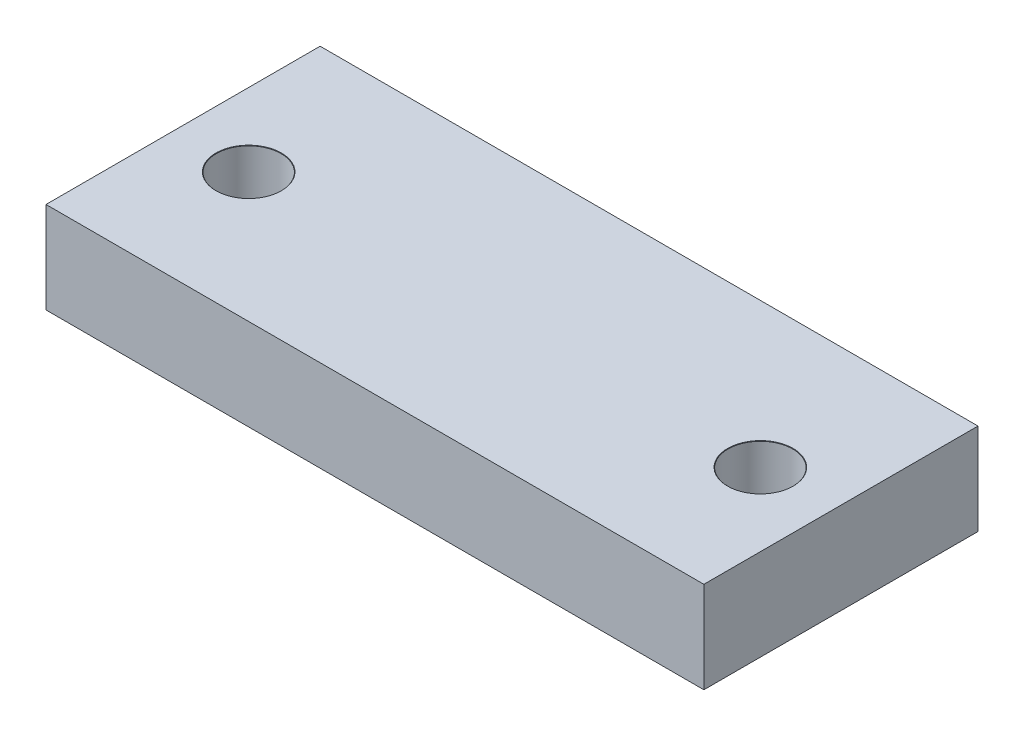
ISO-10303-21;
HEADER;
FILE_DESCRIPTION(('STEP AP214'),'2;1');
FILE_NAME('part.step','',(''),(''),'','','');
FILE_SCHEMA(('AUTOMOTIVE_DESIGN { 1 0 10303 214 1 1 1 1 }'));
ENDSEC;
DATA;
#1=APPLICATION_CONTEXT('core data for automotive mechanical design processes');
#2=APPLICATION_PROTOCOL_DEFINITION('international standard','automotive_design',2000,#1);
#3=PRODUCT_CONTEXT('',#1,'mechanical');
#4=PRODUCT('Part','Part','',(#3));
#5=PRODUCT_RELATED_PRODUCT_CATEGORY('part','',(#4));
#6=PRODUCT_DEFINITION_FORMATION('','',#4);
#7=PRODUCT_DEFINITION_CONTEXT('part definition',#1,'design');
#8=PRODUCT_DEFINITION('design','',#6,#7);
#9=PRODUCT_DEFINITION_SHAPE('','',#8);
#10=(LENGTH_UNIT() NAMED_UNIT(*) SI_UNIT(.MILLI.,.METRE.));
#11=(NAMED_UNIT(*) PLANE_ANGLE_UNIT() SI_UNIT($,.RADIAN.));
#12=(NAMED_UNIT(*) SI_UNIT($,.STERADIAN.) SOLID_ANGLE_UNIT());
#13=UNCERTAINTY_MEASURE_WITH_UNIT(LENGTH_MEASURE(1.E-05),#10,'distance_accuracy_value','');
#14=(GEOMETRIC_REPRESENTATION_CONTEXT(3) GLOBAL_UNCERTAINTY_ASSIGNED_CONTEXT((#13)) GLOBAL_UNIT_ASSIGNED_CONTEXT((#10,
#11,#12)) REPRESENTATION_CONTEXT('',''));
#15=CARTESIAN_POINT('',(0.,0.,0.));
#16=DIRECTION('',(0.,0.,1.));
#17=DIRECTION('',(1.,0.,0.));
#18=AXIS2_PLACEMENT_3D('',#15,#16,#17);
#19=CARTESIAN_POINT('',(0.,3.175,0.));
#20=DIRECTION('',(1.,0.,0.));
#21=DIRECTION('',(0.,0.,-1.));
#22=AXIS2_PLACEMENT_3D('',#19,#20,#21);
#23=PLANE('',#22);
#24=DIRECTION('',(0.,0.,1.));
#25=VECTOR('',#24,1.);
#26=CARTESIAN_POINT('',(0.,-3.175,0.));
#27=LINE('',#26,#25);
#28=CARTESIAN_POINT('',(0.,-3.175,-19.05));
#29=VERTEX_POINT('',#28);
#30=CARTESIAN_POINT('',(0.,-3.175,0.));
#31=VERTEX_POINT('',#30);
#32=EDGE_CURVE('E113',#29,#31,#27,.T.);
#33=ORIENTED_EDGE('',*,*,#32,.T.);
#34=DIRECTION('',(0.,-1.,0.));
#35=VECTOR('',#34,1.);
#36=CARTESIAN_POINT('',(0.,3.175,0.));
#37=LINE('',#36,#35);
#38=CARTESIAN_POINT('',(0.,3.175,0.));
#39=VERTEX_POINT('',#38);
#40=EDGE_CURVE('E11',#39,#31,#37,.T.);
#41=ORIENTED_EDGE('',*,*,#40,.F.);
#42=DIRECTION('',(0.,0.,1.));
#43=VECTOR('',#42,1.);
#44=CARTESIAN_POINT('',(0.,3.175,0.));
#45=LINE('',#44,#43);
#46=CARTESIAN_POINT('',(0.,3.175,-19.05));
#47=VERTEX_POINT('',#46);
#48=EDGE_CURVE('E97',#47,#39,#45,.T.);
#49=ORIENTED_EDGE('',*,*,#48,.F.);
#50=DIRECTION('',(0.,-1.,0.));
#51=VECTOR('',#50,1.);
#52=CARTESIAN_POINT('',(0.,3.175,-19.05));
#53=LINE('',#52,#51);
#54=EDGE_CURVE('E109',#47,#29,#53,.T.);
#55=ORIENTED_EDGE('',*,*,#54,.T.);
#56=EDGE_LOOP('',(#33,#41,#49,#55));
#57=FACE_BOUND('',#56,.T.);
#58=ADVANCED_FACE('F45',(#57),#23,.F.);
#59=CARTESIAN_POINT('',(0.,3.175,0.));
#60=DIRECTION('',(0.,0.,-1.));
#61=DIRECTION('',(-1.,0.,0.));
#62=AXIS2_PLACEMENT_3D('',#59,#60,#61);
#63=PLANE('',#62);
#64=DIRECTION('',(1.,0.,0.));
#65=VECTOR('',#64,1.);
#66=CARTESIAN_POINT('',(0.,-3.175,0.));
#67=LINE('',#66,#65);
#68=CARTESIAN_POINT('',(45.72,-3.175,0.));
#69=VERTEX_POINT('',#68);
#70=EDGE_CURVE('E102',#31,#69,#67,.T.);
#71=ORIENTED_EDGE('',*,*,#70,.T.);
#72=DIRECTION('',(0.,-1.,0.));
#73=VECTOR('',#72,1.);
#74=CARTESIAN_POINT('',(45.72,3.175,0.));
#75=LINE('',#74,#73);
#76=CARTESIAN_POINT('',(45.72,3.175,0.));
#77=VERTEX_POINT('',#76);
#78=EDGE_CURVE('E54',#77,#69,#75,.T.);
#79=ORIENTED_EDGE('',*,*,#78,.F.);
#80=DIRECTION('',(1.,0.,0.));
#81=VECTOR('',#80,1.);
#82=CARTESIAN_POINT('',(0.,3.175,0.));
#83=LINE('',#82,#81);
#84=EDGE_CURVE('E92',#39,#77,#83,.T.);
#85=ORIENTED_EDGE('',*,*,#84,.F.);
#86=ORIENTED_EDGE('',*,*,#40,.T.);
#87=EDGE_LOOP('',(#71,#79,#85,#86));
#88=FACE_BOUND('',#87,.T.);
#89=ADVANCED_FACE('F101',(#88),#63,.F.);
#90=CARTESIAN_POINT('',(45.72,3.175,0.));
#91=DIRECTION('',(-1.,0.,0.));
#92=DIRECTION('',(0.,0.,1.));
#93=AXIS2_PLACEMENT_3D('',#90,#91,#92);
#94=PLANE('',#93);
#95=DIRECTION('',(0.,0.,-1.));
#96=VECTOR('',#95,1.);
#97=CARTESIAN_POINT('',(45.72,-3.175,0.));
#98=LINE('',#97,#96);
#99=CARTESIAN_POINT('',(45.72,-3.175,-19.05));
#100=VERTEX_POINT('',#99);
#101=EDGE_CURVE('E79',#69,#100,#98,.T.);
#102=ORIENTED_EDGE('',*,*,#101,.T.);
#103=DIRECTION('',(0.,-1.,0.));
#104=VECTOR('',#103,1.);
#105=CARTESIAN_POINT('',(45.72,3.175,-19.05));
#106=LINE('',#105,#104);
#107=CARTESIAN_POINT('',(45.72,3.175,-19.05));
#108=VERTEX_POINT('',#107);
#109=EDGE_CURVE('E104',#108,#100,#106,.T.);
#110=ORIENTED_EDGE('',*,*,#109,.F.);
#111=DIRECTION('',(0.,0.,-1.));
#112=VECTOR('',#111,1.);
#113=CARTESIAN_POINT('',(45.72,3.175,0.));
#114=LINE('',#113,#112);
#115=EDGE_CURVE('E95',#77,#108,#114,.T.);
#116=ORIENTED_EDGE('',*,*,#115,.F.);
#117=ORIENTED_EDGE('',*,*,#78,.T.);
#118=EDGE_LOOP('',(#102,#110,#116,#117));
#119=FACE_BOUND('',#118,.T.);
#120=ADVANCED_FACE('F105',(#119),#94,.F.);
#121=CARTESIAN_POINT('',(0.,3.175,-19.05));
#122=DIRECTION('',(0.,0.,1.));
#123=DIRECTION('',(1.,0.,0.));
#124=AXIS2_PLACEMENT_3D('',#121,#122,#123);
#125=PLANE('',#124);
#126=DIRECTION('',(-1.,0.,0.));
#127=VECTOR('',#126,1.);
#128=CARTESIAN_POINT('',(0.,-3.175,-19.05));
#129=LINE('',#128,#127);
#130=EDGE_CURVE('E85',#100,#29,#129,.T.);
#131=ORIENTED_EDGE('',*,*,#130,.T.);
#132=ORIENTED_EDGE('',*,*,#54,.F.);
#133=DIRECTION('',(-1.,0.,0.));
#134=VECTOR('',#133,1.);
#135=CARTESIAN_POINT('',(0.,3.175,-19.05));
#136=LINE('',#135,#134);
#137=EDGE_CURVE('E62',#108,#47,#136,.T.);
#138=ORIENTED_EDGE('',*,*,#137,.F.);
#139=ORIENTED_EDGE('',*,*,#109,.T.);
#140=EDGE_LOOP('',(#131,#132,#138,#139));
#141=FACE_BOUND('',#140,.T.);
#142=ADVANCED_FACE('F127',(#141),#125,.F.);
#143=CARTESIAN_POINT('',(0.,3.175,0.));
#144=DIRECTION('',(0.,-1.,0.));
#145=DIRECTION('',(0.,0.,-1.));
#146=AXIS2_PLACEMENT_3D('',#143,#144,#145);
#147=PLANE('',#146);
#148=CARTESIAN_POINT('',(5.08,3.175,-9.00542949821097));
#149=DIRECTION('',(0.,1.,0.));
#150=DIRECTION('',(0.,0.,1.));
#151=AXIS2_PLACEMENT_3D('',#148,#149,#150);
#152=CIRCLE('',#151,2.275);
#153=CARTESIAN_POINT('',(5.08,3.175,-6.73042949821098));
#154=VERTEX_POINT('',#153);
#155=EDGE_CURVE('E153',#154,#154,#152,.T.);
#156=ORIENTED_EDGE('',*,*,#155,.F.);
#157=EDGE_LOOP('',(#156));
#158=FACE_BOUND('',#157,.T.);
#159=CARTESIAN_POINT('',(40.64,3.175,-9.00542949821098));
#160=DIRECTION('',(0.,1.,0.));
#161=DIRECTION('',(0.,0.,1.));
#162=AXIS2_PLACEMENT_3D('',#159,#160,#161);
#163=CIRCLE('',#162,2.275);
#164=CARTESIAN_POINT('',(40.64,3.175,-6.73042949821098));
#165=VERTEX_POINT('',#164);
#166=EDGE_CURVE('E141',#165,#165,#163,.T.);
#167=ORIENTED_EDGE('',*,*,#166,.F.);
#168=EDGE_LOOP('',(#167));
#169=FACE_BOUND('',#168,.T.);
#170=ORIENTED_EDGE('',*,*,#48,.T.);
#171=ORIENTED_EDGE('',*,*,#84,.T.);
#172=ORIENTED_EDGE('',*,*,#115,.T.);
#173=ORIENTED_EDGE('',*,*,#137,.T.);
#174=EDGE_LOOP('',(#170,#171,#172,#173));
#175=FACE_BOUND('',#174,.T.);
#176=ADVANCED_FACE('F93',(#158,#169,#175),#147,.F.);
#177=CARTESIAN_POINT('',(0.,-3.175,0.));
#178=DIRECTION('',(0.,-1.,0.));
#179=DIRECTION('',(0.,0.,-1.));
#180=AXIS2_PLACEMENT_3D('',#177,#178,#179);
#181=PLANE('',#180);
#182=CARTESIAN_POINT('',(5.08,-3.175,-9.00542949821097));
#183=DIRECTION('',(0.,1.,0.));
#184=DIRECTION('',(0.,0.,1.));
#185=AXIS2_PLACEMENT_3D('',#182,#183,#184);
#186=CIRCLE('',#185,2.25);
#187=CARTESIAN_POINT('',(5.08,-3.175,-6.75542949821098));
#188=VERTEX_POINT('',#187);
#189=EDGE_CURVE('E145',#188,#188,#186,.T.);
#190=ORIENTED_EDGE('',*,*,#189,.T.);
#191=EDGE_LOOP('',(#190));
#192=FACE_BOUND('',#191,.T.);
#193=CARTESIAN_POINT('',(40.64,-3.175,-9.00542949821098));
#194=DIRECTION('',(0.,1.,0.));
#195=DIRECTION('',(0.,0.,1.));
#196=AXIS2_PLACEMENT_3D('',#193,#194,#195);
#197=CIRCLE('',#196,2.25);
#198=CARTESIAN_POINT('',(40.64,-3.175,-6.75542949821099));
#199=VERTEX_POINT('',#198);
#200=EDGE_CURVE('E117',#199,#199,#197,.T.);
#201=ORIENTED_EDGE('',*,*,#200,.T.);
#202=EDGE_LOOP('',(#201));
#203=FACE_BOUND('',#202,.T.);
#204=ORIENTED_EDGE('',*,*,#32,.F.);
#205=ORIENTED_EDGE('',*,*,#130,.F.);
#206=ORIENTED_EDGE('',*,*,#101,.F.);
#207=ORIENTED_EDGE('',*,*,#70,.F.);
#208=EDGE_LOOP('',(#204,#205,#206,#207));
#209=FACE_BOUND('',#208,.T.);
#210=ADVANCED_FACE('F130',(#192,#203,#209),#181,.T.);
#211=CARTESIAN_POINT('',(40.64,3.175,-9.00542949821098));
#212=DIRECTION('',(0.,1.,0.));
#213=DIRECTION('',(0.,0.,1.));
#214=AXIS2_PLACEMENT_3D('',#211,#212,#213);
#215=CYLINDRICAL_SURFACE('',#214,2.24999999999999);
#216=ORIENTED_EDGE('',*,*,#200,.F.);
#217=EDGE_LOOP('',(#216));
#218=FACE_BOUND('',#217,.T.);
#219=CARTESIAN_POINT('',(40.64,3.15,-9.00542949821098));
#220=DIRECTION('',(0.,1.,0.));
#221=DIRECTION('',(0.,0.,1.));
#222=AXIS2_PLACEMENT_3D('',#219,#220,#221);
#223=CIRCLE('',#222,2.24999999999999);
#224=CARTESIAN_POINT('',(40.64,3.15,-6.75542949821099));
#225=VERTEX_POINT('',#224);
#226=EDGE_CURVE('E137',#225,#225,#223,.T.);
#227=ORIENTED_EDGE('',*,*,#226,.T.);
#228=EDGE_LOOP('',(#227));
#229=FACE_BOUND('',#228,.T.);
#230=ADVANCED_FACE('F168',(#218,#229),#215,.F.);
#231=CARTESIAN_POINT('',(40.64,3.175,-9.00542949821098));
#232=DIRECTION('',(0.,1.,0.));
#233=DIRECTION('',(0.,0.,1.));
#234=AXIS2_PLACEMENT_3D('',#231,#232,#233);
#235=CONICAL_SURFACE('',#234,2.275,0.785398163397691);
#236=ORIENTED_EDGE('',*,*,#226,.F.);
#237=EDGE_LOOP('',(#236));
#238=FACE_BOUND('',#237,.T.);
#239=ORIENTED_EDGE('',*,*,#166,.T.);
#240=EDGE_LOOP('',(#239));
#241=FACE_BOUND('',#240,.T.);
#242=ADVANCED_FACE('F165',(#238,#241),#235,.F.);
#243=CARTESIAN_POINT('',(5.08,3.175,-9.00542949821097));
#244=DIRECTION('',(0.,1.,0.));
#245=DIRECTION('',(0.,0.,1.));
#246=AXIS2_PLACEMENT_3D('',#243,#244,#245);
#247=CYLINDRICAL_SURFACE('',#246,2.24999999999999);
#248=ORIENTED_EDGE('',*,*,#189,.F.);
#249=EDGE_LOOP('',(#248));
#250=FACE_BOUND('',#249,.T.);
#251=CARTESIAN_POINT('',(5.08,3.15,-9.00542949821097));
#252=DIRECTION('',(0.,1.,0.));
#253=DIRECTION('',(0.,0.,1.));
#254=AXIS2_PLACEMENT_3D('',#251,#252,#253);
#255=CIRCLE('',#254,2.24999999999999);
#256=CARTESIAN_POINT('',(5.08,3.15,-6.75542949821099));
#257=VERTEX_POINT('',#256);
#258=EDGE_CURVE('E149',#257,#257,#255,.T.);
#259=ORIENTED_EDGE('',*,*,#258,.T.);
#260=EDGE_LOOP('',(#259));
#261=FACE_BOUND('',#260,.T.);
#262=ADVANCED_FACE('F167',(#250,#261),#247,.F.);
#263=CARTESIAN_POINT('',(5.08,3.175,-9.00542949821097));
#264=DIRECTION('',(0.,1.,0.));
#265=DIRECTION('',(0.,0.,1.));
#266=AXIS2_PLACEMENT_3D('',#263,#264,#265);
#267=CONICAL_SURFACE('',#266,2.275,0.785398163397691);
#268=ORIENTED_EDGE('',*,*,#258,.F.);
#269=EDGE_LOOP('',(#268));
#270=FACE_BOUND('',#269,.T.);
#271=ORIENTED_EDGE('',*,*,#155,.T.);
#272=EDGE_LOOP('',(#271));
#273=FACE_BOUND('',#272,.T.);
#274=ADVANCED_FACE('F158',(#270,#273),#267,.F.);
#275=CLOSED_SHELL('',(#58,#89,#120,#142,#176,#210,#230,#242,#262,#274));
#276=MANIFOLD_SOLID_BREP('B2',#275);
#277=ADVANCED_BREP_SHAPE_REPRESENTATION('',(#18,#276),#14);
#278=SHAPE_DEFINITION_REPRESENTATION(#9,#277);
ENDSEC;
END-ISO-10303-21;
